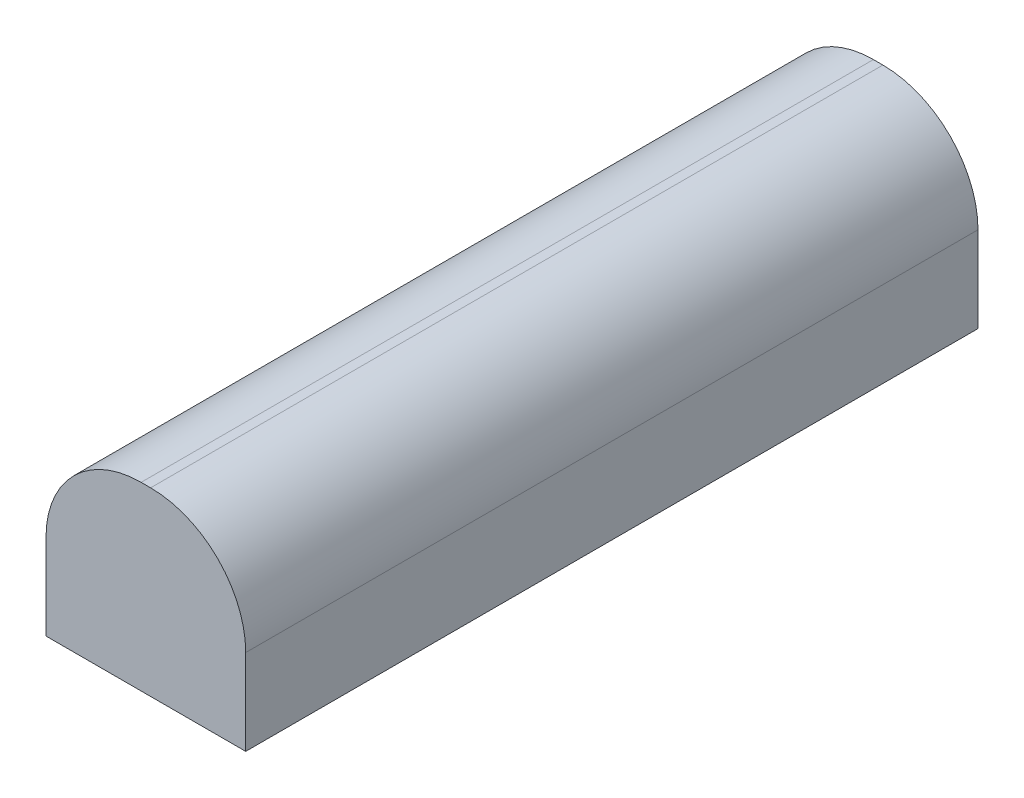
ISO-10303-21;
HEADER;
FILE_DESCRIPTION(('STEP AP214'),'2;1');
FILE_NAME('part.step','',(''),(''),'','','');
FILE_SCHEMA(('AUTOMOTIVE_DESIGN { 1 0 10303 214 1 1 1 1 }'));
ENDSEC;
DATA;
#1=APPLICATION_CONTEXT('core data for automotive mechanical design processes');
#2=APPLICATION_PROTOCOL_DEFINITION('international standard','automotive_design',2000,#1);
#3=PRODUCT_CONTEXT('',#1,'mechanical');
#4=PRODUCT('Part','Part','',(#3));
#5=PRODUCT_RELATED_PRODUCT_CATEGORY('part','',(#4));
#6=PRODUCT_DEFINITION_FORMATION('','',#4);
#7=PRODUCT_DEFINITION_CONTEXT('part definition',#1,'design');
#8=PRODUCT_DEFINITION('design','',#6,#7);
#9=PRODUCT_DEFINITION_SHAPE('','',#8);
#10=(LENGTH_UNIT() NAMED_UNIT(*) SI_UNIT(.MILLI.,.METRE.));
#11=(NAMED_UNIT(*) PLANE_ANGLE_UNIT() SI_UNIT($,.RADIAN.));
#12=(NAMED_UNIT(*) SI_UNIT($,.STERADIAN.) SOLID_ANGLE_UNIT());
#13=UNCERTAINTY_MEASURE_WITH_UNIT(LENGTH_MEASURE(1.E-05),#10,'distance_accuracy_value','');
#14=(GEOMETRIC_REPRESENTATION_CONTEXT(3) GLOBAL_UNCERTAINTY_ASSIGNED_CONTEXT((#13)) GLOBAL_UNIT_ASSIGNED_CONTEXT((#10,
#11,#12)) REPRESENTATION_CONTEXT('',''));
#15=CARTESIAN_POINT('',(0.,0.,0.));
#16=DIRECTION('',(0.,0.,1.));
#17=DIRECTION('',(1.,0.,0.));
#18=AXIS2_PLACEMENT_3D('',#15,#16,#17);
#19=CARTESIAN_POINT('',(0.,19.,0.));
#20=DIRECTION('',(1.,0.,0.));
#21=DIRECTION('',(0.,0.,-1.));
#22=AXIS2_PLACEMENT_3D('',#19,#20,#21);
#23=PLANE('',#22);
#24=DIRECTION('',(0.,-1.,0.));
#25=VECTOR('',#24,1.);
#26=CARTESIAN_POINT('',(0.,19.,0.));
#27=LINE('',#26,#25);
#28=CARTESIAN_POINT('',(0.,9.,0.));
#29=VERTEX_POINT('',#28);
#30=CARTESIAN_POINT('',(0.,0.,0.));
#31=VERTEX_POINT('',#30);
#32=EDGE_CURVE('E85',#29,#31,#27,.T.);
#33=ORIENTED_EDGE('',*,*,#32,.F.);
#34=DIRECTION('',(0.,0.,1.));
#35=VECTOR('',#34,1.);
#36=CARTESIAN_POINT('',(0.,9.,0.));
#37=LINE('',#36,#35);
#38=CARTESIAN_POINT('',(0.,9.,-77.));
#39=VERTEX_POINT('',#38);
#40=EDGE_CURVE('E56',#29,#39,#37,.F.);
#41=ORIENTED_EDGE('',*,*,#40,.T.);
#42=DIRECTION('',(0.,-1.,0.));
#43=VECTOR('',#42,1.);
#44=CARTESIAN_POINT('',(0.,19.,-77.));
#45=LINE('',#44,#43);
#46=CARTESIAN_POINT('',(0.,0.,-77.));
#47=VERTEX_POINT('',#46);
#48=EDGE_CURVE('E105',#39,#47,#45,.T.);
#49=ORIENTED_EDGE('',*,*,#48,.T.);
#50=DIRECTION('',(0.,0.,1.));
#51=VECTOR('',#50,1.);
#52=CARTESIAN_POINT('',(0.,0.,0.));
#53=LINE('',#52,#51);
#54=EDGE_CURVE('E101',#47,#31,#53,.T.);
#55=ORIENTED_EDGE('',*,*,#54,.T.);
#56=EDGE_LOOP('',(#33,#41,#49,#55));
#57=FACE_BOUND('',#56,.T.);
#58=ADVANCED_FACE('F33',(#57),#23,.F.);
#59=CARTESIAN_POINT('',(0.,19.,0.));
#60=DIRECTION('',(0.,0.,-1.));
#61=DIRECTION('',(-1.,0.,0.));
#62=AXIS2_PLACEMENT_3D('',#59,#60,#61);
#63=PLANE('',#62);
#64=DIRECTION('',(1.,0.,0.));
#65=VECTOR('',#64,1.);
#66=CARTESIAN_POINT('',(0.,19.,0.));
#67=LINE('',#66,#65);
#68=CARTESIAN_POINT('',(10.,19.,0.));
#69=VERTEX_POINT('',#68);
#70=CARTESIAN_POINT('',(11.,19.,0.));
#71=VERTEX_POINT('',#70);
#72=EDGE_CURVE('E115',#69,#71,#67,.T.);
#73=ORIENTED_EDGE('',*,*,#72,.F.);
#74=CARTESIAN_POINT('',(10.,9.,0.));
#75=DIRECTION('',(0.,0.,-1.));
#76=DIRECTION('',(-1.,0.,0.));
#77=AXIS2_PLACEMENT_3D('',#74,#75,#76);
#78=CIRCLE('',#77,10.);
#79=EDGE_CURVE('E92',#69,#29,#78,.F.);
#80=ORIENTED_EDGE('',*,*,#79,.T.);
#81=ORIENTED_EDGE('',*,*,#32,.T.);
#82=DIRECTION('',(1.,0.,0.));
#83=VECTOR('',#82,1.);
#84=CARTESIAN_POINT('',(0.,0.,0.));
#85=LINE('',#84,#83);
#86=CARTESIAN_POINT('',(21.,0.,0.));
#87=VERTEX_POINT('',#86);
#88=EDGE_CURVE('E90',#31,#87,#85,.T.);
#89=ORIENTED_EDGE('',*,*,#88,.T.);
#90=DIRECTION('',(0.,-1.,0.));
#91=VECTOR('',#90,1.);
#92=CARTESIAN_POINT('',(21.,19.,0.));
#93=LINE('',#92,#91);
#94=CARTESIAN_POINT('',(21.,9.,0.));
#95=VERTEX_POINT('',#94);
#96=EDGE_CURVE('E95',#95,#87,#93,.T.);
#97=ORIENTED_EDGE('',*,*,#96,.F.);
#98=CARTESIAN_POINT('',(11.,9.,0.));
#99=DIRECTION('',(0.,0.,-1.));
#100=DIRECTION('',(-1.,0.,0.));
#101=AXIS2_PLACEMENT_3D('',#98,#99,#100);
#102=CIRCLE('',#101,10.);
#103=EDGE_CURVE('E125',#95,#71,#102,.F.);
#104=ORIENTED_EDGE('',*,*,#103,.T.);
#105=EDGE_LOOP('',(#73,#80,#81,#89,#97,#104));
#106=FACE_BOUND('',#105,.T.);
#107=ADVANCED_FACE('F88',(#106),#63,.F.);
#108=CARTESIAN_POINT('',(21.,19.,0.));
#109=DIRECTION('',(-1.,0.,0.));
#110=DIRECTION('',(0.,0.,1.));
#111=AXIS2_PLACEMENT_3D('',#108,#109,#110);
#112=PLANE('',#111);
#113=DIRECTION('',(0.,-1.,0.));
#114=VECTOR('',#113,1.);
#115=CARTESIAN_POINT('',(21.,19.,-77.));
#116=LINE('',#115,#114);
#117=CARTESIAN_POINT('',(21.,9.,-77.));
#118=VERTEX_POINT('',#117);
#119=CARTESIAN_POINT('',(21.,0.,-77.));
#120=VERTEX_POINT('',#119);
#121=EDGE_CURVE('E117',#118,#120,#116,.T.);
#122=ORIENTED_EDGE('',*,*,#121,.F.);
#123=DIRECTION('',(0.,0.,-1.));
#124=VECTOR('',#123,1.);
#125=CARTESIAN_POINT('',(21.,9.,0.));
#126=LINE('',#125,#124);
#127=EDGE_CURVE('E11',#118,#95,#126,.F.);
#128=ORIENTED_EDGE('',*,*,#127,.T.);
#129=ORIENTED_EDGE('',*,*,#96,.T.);
#130=DIRECTION('',(0.,0.,-1.));
#131=VECTOR('',#130,1.);
#132=CARTESIAN_POINT('',(21.,0.,0.));
#133=LINE('',#132,#131);
#134=EDGE_CURVE('E103',#87,#120,#133,.T.);
#135=ORIENTED_EDGE('',*,*,#134,.T.);
#136=EDGE_LOOP('',(#122,#128,#129,#135));
#137=FACE_BOUND('',#136,.T.);
#138=ADVANCED_FACE('F151',(#137),#112,.F.);
#139=CARTESIAN_POINT('',(0.,19.,-77.));
#140=DIRECTION('',(0.,0.,1.));
#141=DIRECTION('',(1.,0.,0.));
#142=AXIS2_PLACEMENT_3D('',#139,#140,#141);
#143=PLANE('',#142);
#144=ORIENTED_EDGE('',*,*,#48,.F.);
#145=CARTESIAN_POINT('',(10.,9.,-77.));
#146=DIRECTION('',(0.,0.,1.));
#147=DIRECTION('',(1.,0.,0.));
#148=AXIS2_PLACEMENT_3D('',#145,#146,#147);
#149=CIRCLE('',#148,10.);
#150=CARTESIAN_POINT('',(10.,19.,-77.));
#151=VERTEX_POINT('',#150);
#152=EDGE_CURVE('E41',#39,#151,#149,.F.);
#153=ORIENTED_EDGE('',*,*,#152,.T.);
#154=DIRECTION('',(-1.,0.,0.));
#155=VECTOR('',#154,1.);
#156=CARTESIAN_POINT('',(0.,19.,-77.));
#157=LINE('',#156,#155);
#158=CARTESIAN_POINT('',(11.,19.,-77.));
#159=VERTEX_POINT('',#158);
#160=EDGE_CURVE('E109',#159,#151,#157,.T.);
#161=ORIENTED_EDGE('',*,*,#160,.F.);
#162=CARTESIAN_POINT('',(11.,9.,-77.));
#163=DIRECTION('',(0.,0.,1.));
#164=DIRECTION('',(1.,0.,0.));
#165=AXIS2_PLACEMENT_3D('',#162,#163,#164);
#166=CIRCLE('',#165,10.);
#167=EDGE_CURVE('E48',#159,#118,#166,.F.);
#168=ORIENTED_EDGE('',*,*,#167,.T.);
#169=ORIENTED_EDGE('',*,*,#121,.T.);
#170=DIRECTION('',(-1.,0.,0.));
#171=VECTOR('',#170,1.);
#172=CARTESIAN_POINT('',(0.,0.,-77.));
#173=LINE('',#172,#171);
#174=EDGE_CURVE('E113',#120,#47,#173,.T.);
#175=ORIENTED_EDGE('',*,*,#174,.T.);
#176=EDGE_LOOP('',(#144,#153,#161,#168,#169,#175));
#177=FACE_BOUND('',#176,.T.);
#178=ADVANCED_FACE('F131',(#177),#143,.F.);
#179=CARTESIAN_POINT('',(0.,19.,0.));
#180=DIRECTION('',(0.,-1.,0.));
#181=DIRECTION('',(0.,0.,-1.));
#182=AXIS2_PLACEMENT_3D('',#179,#180,#181);
#183=PLANE('',#182);
#184=ORIENTED_EDGE('',*,*,#160,.T.);
#185=DIRECTION('',(0.,0.,1.));
#186=VECTOR('',#185,1.);
#187=CARTESIAN_POINT('',(10.,19.,0.));
#188=LINE('',#187,#186);
#189=EDGE_CURVE('E122',#151,#69,#188,.T.);
#190=ORIENTED_EDGE('',*,*,#189,.T.);
#191=ORIENTED_EDGE('',*,*,#72,.T.);
#192=DIRECTION('',(0.,0.,-1.));
#193=VECTOR('',#192,1.);
#194=CARTESIAN_POINT('',(11.,19.,0.));
#195=LINE('',#194,#193);
#196=EDGE_CURVE('E94',#71,#159,#195,.T.);
#197=ORIENTED_EDGE('',*,*,#196,.T.);
#198=EDGE_LOOP('',(#184,#190,#191,#197));
#199=FACE_BOUND('',#198,.T.);
#200=ADVANCED_FACE('F135',(#199),#183,.F.);
#201=CARTESIAN_POINT('',(0.,0.,0.));
#202=DIRECTION('',(0.,-1.,0.));
#203=DIRECTION('',(0.,0.,-1.));
#204=AXIS2_PLACEMENT_3D('',#201,#202,#203);
#205=PLANE('',#204);
#206=ORIENTED_EDGE('',*,*,#54,.F.);
#207=ORIENTED_EDGE('',*,*,#174,.F.);
#208=ORIENTED_EDGE('',*,*,#134,.F.);
#209=ORIENTED_EDGE('',*,*,#88,.F.);
#210=EDGE_LOOP('',(#206,#207,#208,#209));
#211=FACE_BOUND('',#210,.T.);
#212=ADVANCED_FACE('F99',(#211),#205,.T.);
#213=CARTESIAN_POINT('',(10.,9.,0.));
#214=DIRECTION('',(0.,0.,1.));
#215=DIRECTION('',(1.,0.,0.));
#216=AXIS2_PLACEMENT_3D('',#213,#214,#215);
#217=CYLINDRICAL_SURFACE('',#216,10.);
#218=ORIENTED_EDGE('',*,*,#152,.F.);
#219=ORIENTED_EDGE('',*,*,#40,.F.);
#220=ORIENTED_EDGE('',*,*,#79,.F.);
#221=ORIENTED_EDGE('',*,*,#189,.F.);
#222=EDGE_LOOP('',(#218,#219,#220,#221));
#223=FACE_BOUND('',#222,.T.);
#224=ADVANCED_FACE('F138',(#223),#217,.T.);
#225=CARTESIAN_POINT('',(11.,9.,0.));
#226=DIRECTION('',(0.,0.,-1.));
#227=DIRECTION('',(-1.,0.,0.));
#228=AXIS2_PLACEMENT_3D('',#225,#226,#227);
#229=CYLINDRICAL_SURFACE('',#228,10.);
#230=ORIENTED_EDGE('',*,*,#103,.F.);
#231=ORIENTED_EDGE('',*,*,#127,.F.);
#232=ORIENTED_EDGE('',*,*,#167,.F.);
#233=ORIENTED_EDGE('',*,*,#196,.F.);
#234=EDGE_LOOP('',(#230,#231,#232,#233));
#235=FACE_BOUND('',#234,.T.);
#236=ADVANCED_FACE('F35',(#235),#229,.T.);
#237=CLOSED_SHELL('',(#58,#107,#138,#178,#200,#212,#224,#236));
#238=MANIFOLD_SOLID_BREP('B2',#237);
#239=ADVANCED_BREP_SHAPE_REPRESENTATION('',(#18,#238),#14);
#240=SHAPE_DEFINITION_REPRESENTATION(#9,#239);
ENDSEC;
END-ISO-10303-21;
